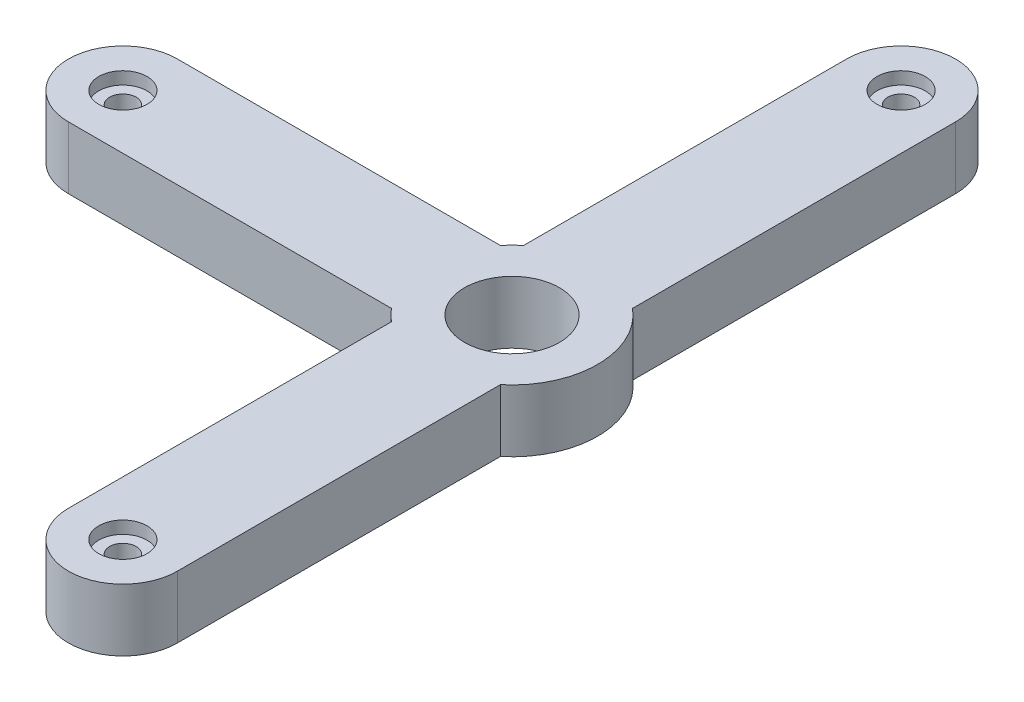
ISO-10303-21;
HEADER;
FILE_DESCRIPTION(('STEP AP214'),'2;1');
FILE_NAME('part.step','',(''),(''),'','','');
FILE_SCHEMA(('AUTOMOTIVE_DESIGN { 1 0 10303 214 1 1 1 1 }'));
ENDSEC;
DATA;
#1=APPLICATION_CONTEXT('core data for automotive mechanical design processes');
#2=APPLICATION_PROTOCOL_DEFINITION('international standard','automotive_design',2000,#1);
#3=PRODUCT_CONTEXT('',#1,'mechanical');
#4=PRODUCT('Part','Part','',(#3));
#5=PRODUCT_RELATED_PRODUCT_CATEGORY('part','',(#4));
#6=PRODUCT_DEFINITION_FORMATION('','',#4);
#7=PRODUCT_DEFINITION_CONTEXT('part definition',#1,'design');
#8=PRODUCT_DEFINITION('design','',#6,#7);
#9=PRODUCT_DEFINITION_SHAPE('','',#8);
#10=(LENGTH_UNIT() NAMED_UNIT(*) SI_UNIT(.MILLI.,.METRE.));
#11=(NAMED_UNIT(*) PLANE_ANGLE_UNIT() SI_UNIT($,.RADIAN.));
#12=(NAMED_UNIT(*) SI_UNIT($,.STERADIAN.) SOLID_ANGLE_UNIT());
#13=UNCERTAINTY_MEASURE_WITH_UNIT(LENGTH_MEASURE(1.E-05),#10,'distance_accuracy_value','');
#14=(GEOMETRIC_REPRESENTATION_CONTEXT(3) GLOBAL_UNCERTAINTY_ASSIGNED_CONTEXT((#13)) GLOBAL_UNIT_ASSIGNED_CONTEXT((#10,
#11,#12)) REPRESENTATION_CONTEXT('',''));
#15=CARTESIAN_POINT('',(0.,0.,0.));
#16=DIRECTION('',(0.,0.,1.));
#17=DIRECTION('',(1.,0.,0.));
#18=AXIS2_PLACEMENT_3D('',#15,#16,#17);
#19=CARTESIAN_POINT('',(-106.291651245989,-150.6,0.));
#20=DIRECTION('',(0.,1.,0.));
#21=DIRECTION('',(0.,0.,1.));
#22=AXIS2_PLACEMENT_3D('',#19,#20,#21);
#23=PLANE('',#22);
#24=CARTESIAN_POINT('',(-106.291651245989,-150.6,0.));
#25=DIRECTION('',(0.,1.,0.));
#26=DIRECTION('',(0.,0.,1.));
#27=AXIS2_PLACEMENT_3D('',#24,#25,#26);
#28=CIRCLE('',#27,1.69999999999999);
#29=CARTESIAN_POINT('',(-106.291651245989,-150.6,1.69999999999999));
#30=VERTEX_POINT('',#29);
#31=EDGE_CURVE('E222',#30,#30,#28,.T.);
#32=ORIENTED_EDGE('',*,*,#31,.F.);
#33=EDGE_LOOP('',(#32));
#34=FACE_BOUND('',#33,.T.);
#35=CARTESIAN_POINT('',(-106.291651245989,-150.6,0.));
#36=DIRECTION('',(0.,1.,0.));
#37=DIRECTION('',(0.,0.,1.));
#38=AXIS2_PLACEMENT_3D('',#35,#36,#37);
#39=CIRCLE('',#38,3.10000000000001);
#40=CARTESIAN_POINT('',(-106.291651245989,-150.6,3.10000000000001));
#41=VERTEX_POINT('',#40);
#42=EDGE_CURVE('E201',#41,#41,#39,.T.);
#43=ORIENTED_EDGE('',*,*,#42,.T.);
#44=EDGE_LOOP('',(#43));
#45=FACE_BOUND('',#44,.T.);
#46=ADVANCED_FACE('F44',(#34,#45),#23,.T.);
#47=CARTESIAN_POINT('',(-56.2916512459885,-150.6,-50.));
#48=DIRECTION('',(0.,1.,0.));
#49=DIRECTION('',(0.,0.,1.));
#50=AXIS2_PLACEMENT_3D('',#47,#48,#49);
#51=CIRCLE('',#50,1.7);
#52=CARTESIAN_POINT('',(-56.2916512459885,-150.6,-48.3));
#53=VERTEX_POINT('',#52);
#54=EDGE_CURVE('E217',#53,#53,#51,.T.);
#55=ORIENTED_EDGE('',*,*,#54,.F.);
#56=EDGE_LOOP('',(#55));
#57=FACE_BOUND('',#56,.T.);
#58=CARTESIAN_POINT('',(-56.2916512459885,-150.6,-50.));
#59=DIRECTION('',(0.,1.,0.));
#60=DIRECTION('',(0.,0.,1.));
#61=AXIS2_PLACEMENT_3D('',#58,#59,#60);
#62=CIRCLE('',#61,3.1);
#63=CARTESIAN_POINT('',(-56.2916512459885,-150.6,-46.9));
#64=VERTEX_POINT('',#63);
#65=EDGE_CURVE('E199',#64,#64,#62,.T.);
#66=ORIENTED_EDGE('',*,*,#65,.T.);
#67=EDGE_LOOP('',(#66));
#68=FACE_BOUND('',#67,.T.);
#69=ADVANCED_FACE('F351',(#57,#68),#23,.T.);
#70=CARTESIAN_POINT('',(-56.2916512459885,-150.6,50.));
#71=DIRECTION('',(0.,1.,0.));
#72=DIRECTION('',(0.,0.,1.));
#73=AXIS2_PLACEMENT_3D('',#70,#71,#72);
#74=CIRCLE('',#73,1.7);
#75=CARTESIAN_POINT('',(-56.2916512459885,-150.6,51.7));
#76=VERTEX_POINT('',#75);
#77=EDGE_CURVE('E214',#76,#76,#74,.T.);
#78=ORIENTED_EDGE('',*,*,#77,.F.);
#79=EDGE_LOOP('',(#78));
#80=FACE_BOUND('',#79,.T.);
#81=CARTESIAN_POINT('',(-56.2916512459885,-150.6,50.));
#82=DIRECTION('',(0.,1.,0.));
#83=DIRECTION('',(0.,0.,1.));
#84=AXIS2_PLACEMENT_3D('',#81,#82,#83);
#85=CIRCLE('',#84,3.1);
#86=CARTESIAN_POINT('',(-56.2916512459885,-150.6,53.1));
#87=VERTEX_POINT('',#86);
#88=EDGE_CURVE('E195',#87,#87,#85,.T.);
#89=ORIENTED_EDGE('',*,*,#88,.T.);
#90=EDGE_LOOP('',(#89));
#91=FACE_BOUND('',#90,.T.);
#92=ADVANCED_FACE('F352',(#80,#91),#23,.T.);
#93=CARTESIAN_POINT('',(-106.291651245989,-157.,0.));
#94=DIRECTION('',(0.,1.,0.));
#95=DIRECTION('',(0.,0.,1.));
#96=AXIS2_PLACEMENT_3D('',#93,#94,#95);
#97=PLANE('',#96);
#98=CARTESIAN_POINT('',(-106.291651245989,-157.,0.));
#99=DIRECTION('',(0.,1.,0.));
#100=DIRECTION('',(0.,0.,1.));
#101=AXIS2_PLACEMENT_3D('',#98,#99,#100);
#102=CIRCLE('',#101,7.);
#103=CARTESIAN_POINT('',(-106.291651245988,-157.,-7.));
#104=VERTEX_POINT('',#103);
#105=CARTESIAN_POINT('',(-106.291651245989,-157.,7.));
#106=VERTEX_POINT('',#105);
#107=EDGE_CURVE('E138',#104,#106,#102,.T.);
#108=ORIENTED_EDGE('',*,*,#107,.F.);
#109=DIRECTION('',(-1.,0.,0.));
#110=VECTOR('',#109,1.);
#111=CARTESIAN_POINT('',(-64.7769326202272,-157.,-6.99999999999992));
#112=LINE('',#111,#110);
#113=CARTESIAN_POINT('',(-64.7769326202272,-157.,-6.99999999999992));
#114=VERTEX_POINT('',#113);
#115=EDGE_CURVE('E58',#114,#104,#112,.T.);
#116=ORIENTED_EDGE('',*,*,#115,.F.);
#117=CARTESIAN_POINT('',(-56.2916512459885,-157.,0.));
#118=DIRECTION('',(0.,1.,0.));
#119=DIRECTION('',(0.,0.,1.));
#120=AXIS2_PLACEMENT_3D('',#117,#118,#119);
#121=CIRCLE('',#120,11.);
#122=CARTESIAN_POINT('',(-63.2916512459885,-157.,-8.48528137423857));
#123=VERTEX_POINT('',#122);
#124=EDGE_CURVE('E69',#123,#114,#121,.T.);
#125=ORIENTED_EDGE('',*,*,#124,.F.);
#126=DIRECTION('',(0.,0.,1.));
#127=VECTOR('',#126,1.);
#128=CARTESIAN_POINT('',(-63.2916512459885,-157.,-50.));
#129=LINE('',#128,#127);
#130=CARTESIAN_POINT('',(-63.2916512459885,-157.,-50.));
#131=VERTEX_POINT('',#130);
#132=EDGE_CURVE('E271',#131,#123,#129,.T.);
#133=ORIENTED_EDGE('',*,*,#132,.F.);
#134=CARTESIAN_POINT('',(-56.2916512459885,-157.,-50.));
#135=DIRECTION('',(0.,1.,0.));
#136=DIRECTION('',(0.,0.,1.));
#137=AXIS2_PLACEMENT_3D('',#134,#135,#136);
#138=CIRCLE('',#137,7.);
#139=CARTESIAN_POINT('',(-49.2916512459885,-157.,-50.));
#140=VERTEX_POINT('',#139);
#141=EDGE_CURVE('E267',#140,#131,#138,.T.);
#142=ORIENTED_EDGE('',*,*,#141,.F.);
#143=DIRECTION('',(0.,0.,-1.));
#144=VECTOR('',#143,1.);
#145=CARTESIAN_POINT('',(-49.2916512459885,-157.,-8.48528137423857));
#146=LINE('',#145,#144);
#147=CARTESIAN_POINT('',(-49.2916512459885,-157.,-8.48528137423857));
#148=VERTEX_POINT('',#147);
#149=EDGE_CURVE('E270',#148,#140,#146,.T.);
#150=ORIENTED_EDGE('',*,*,#149,.F.);
#151=CARTESIAN_POINT('',(-56.2916512459885,-157.,0.));
#152=DIRECTION('',(0.,1.,0.));
#153=DIRECTION('',(0.,0.,1.));
#154=AXIS2_PLACEMENT_3D('',#151,#152,#153);
#155=CIRCLE('',#154,11.);
#156=CARTESIAN_POINT('',(-49.2916512459885,-157.,8.48528137423857));
#157=VERTEX_POINT('',#156);
#158=EDGE_CURVE('E264',#157,#148,#155,.T.);
#159=ORIENTED_EDGE('',*,*,#158,.F.);
#160=DIRECTION('',(0.,0.,-1.));
#161=VECTOR('',#160,1.);
#162=CARTESIAN_POINT('',(-49.2916512459885,-157.,50.));
#163=LINE('',#162,#161);
#164=CARTESIAN_POINT('',(-49.2916512459885,-157.,50.));
#165=VERTEX_POINT('',#164);
#166=EDGE_CURVE('E263',#165,#157,#163,.T.);
#167=ORIENTED_EDGE('',*,*,#166,.F.);
#168=CARTESIAN_POINT('',(-56.2916512459885,-157.,50.));
#169=DIRECTION('',(0.,1.,0.));
#170=DIRECTION('',(0.,0.,1.));
#171=AXIS2_PLACEMENT_3D('',#168,#169,#170);
#172=CIRCLE('',#171,7.);
#173=CARTESIAN_POINT('',(-63.2916512459885,-157.,50.));
#174=VERTEX_POINT('',#173);
#175=EDGE_CURVE('E261',#174,#165,#172,.T.);
#176=ORIENTED_EDGE('',*,*,#175,.F.);
#177=DIRECTION('',(0.,0.,1.));
#178=VECTOR('',#177,1.);
#179=CARTESIAN_POINT('',(-63.2916512459881,-157.,8.48528137423894));
#180=LINE('',#179,#178);
#181=CARTESIAN_POINT('',(-63.2916512459881,-157.,8.48528137423891));
#182=VERTEX_POINT('',#181);
#183=EDGE_CURVE('E259',#182,#174,#180,.T.);
#184=ORIENTED_EDGE('',*,*,#183,.F.);
#185=CARTESIAN_POINT('',(-56.2916512459885,-157.,0.));
#186=DIRECTION('',(0.,1.,0.));
#187=DIRECTION('',(0.,0.,1.));
#188=AXIS2_PLACEMENT_3D('',#185,#186,#187);
#189=CIRCLE('',#188,11.);
#190=CARTESIAN_POINT('',(-64.776932620227,-157.,7.));
#191=VERTEX_POINT('',#190);
#192=EDGE_CURVE('E260',#191,#182,#189,.T.);
#193=ORIENTED_EDGE('',*,*,#192,.F.);
#194=DIRECTION('',(1.,0.,0.));
#195=VECTOR('',#194,1.);
#196=CARTESIAN_POINT('',(-106.291651245989,-157.,7.));
#197=LINE('',#196,#195);
#198=EDGE_CURVE('E254',#106,#191,#197,.T.);
#199=ORIENTED_EDGE('',*,*,#198,.F.);
#200=EDGE_LOOP('',(#108,#116,#125,#133,#142,#150,#159,#167,#176,#184,#193,#199));
#201=FACE_BOUND('',#200,.T.);
#202=CARTESIAN_POINT('',(-106.291651245989,-157.,0.));
#203=DIRECTION('',(0.,1.,0.));
#204=DIRECTION('',(0.,0.,1.));
#205=AXIS2_PLACEMENT_3D('',#202,#203,#204);
#206=CIRCLE('',#205,1.69999999999999);
#207=CARTESIAN_POINT('',(-106.291651245989,-157.,1.69999999999999));
#208=VERTEX_POINT('',#207);
#209=EDGE_CURVE('E253',#208,#208,#206,.T.);
#210=ORIENTED_EDGE('',*,*,#209,.T.);
#211=EDGE_LOOP('',(#210));
#212=FACE_BOUND('',#211,.T.);
#213=CARTESIAN_POINT('',(-56.2916512459885,-157.,-50.));
#214=DIRECTION('',(0.,1.,0.));
#215=DIRECTION('',(0.,0.,1.));
#216=AXIS2_PLACEMENT_3D('',#213,#214,#215);
#217=CIRCLE('',#216,1.7);
#218=CARTESIAN_POINT('',(-56.2916512459885,-157.,-48.3));
#219=VERTEX_POINT('',#218);
#220=EDGE_CURVE('E249',#219,#219,#217,.T.);
#221=ORIENTED_EDGE('',*,*,#220,.T.);
#222=EDGE_LOOP('',(#221));
#223=FACE_BOUND('',#222,.T.);
#224=CARTESIAN_POINT('',(-56.2916512459885,-157.,0.));
#225=DIRECTION('',(0.,1.,0.));
#226=DIRECTION('',(0.,0.,1.));
#227=AXIS2_PLACEMENT_3D('',#224,#225,#226);
#228=CIRCLE('',#227,6.1);
#229=CARTESIAN_POINT('',(-56.2916512459885,-157.,6.1));
#230=VERTEX_POINT('',#229);
#231=EDGE_CURVE('E242',#230,#230,#228,.T.);
#232=ORIENTED_EDGE('',*,*,#231,.T.);
#233=EDGE_LOOP('',(#232));
#234=FACE_BOUND('',#233,.T.);
#235=CARTESIAN_POINT('',(-56.2916512459885,-157.,50.));
#236=DIRECTION('',(0.,1.,0.));
#237=DIRECTION('',(0.,0.,1.));
#238=AXIS2_PLACEMENT_3D('',#235,#236,#237);
#239=CIRCLE('',#238,1.7);
#240=CARTESIAN_POINT('',(-56.2916512459885,-157.,51.7));
#241=VERTEX_POINT('',#240);
#242=EDGE_CURVE('E241',#241,#241,#239,.T.);
#243=ORIENTED_EDGE('',*,*,#242,.T.);
#244=EDGE_LOOP('',(#243));
#245=FACE_BOUND('',#244,.T.);
#246=CARTESIAN_POINT('',(-65.2916512459885,-157.,0.));
#247=DIRECTION('',(0.,1.,0.));
#248=DIRECTION('',(0.,0.,1.));
#249=AXIS2_PLACEMENT_3D('',#246,#247,#248);
#250=CIRCLE('',#249,1.6);
#251=CARTESIAN_POINT('',(-65.2916512459885,-157.,1.6));
#252=VERTEX_POINT('',#251);
#253=EDGE_CURVE('E240',#252,#252,#250,.T.);
#254=ORIENTED_EDGE('',*,*,#253,.T.);
#255=EDGE_LOOP('',(#254));
#256=FACE_BOUND('',#255,.T.);
#257=CARTESIAN_POINT('',(-56.2916512459885,-157.,9.));
#258=DIRECTION('',(0.,1.,0.));
#259=DIRECTION('',(0.,0.,1.));
#260=AXIS2_PLACEMENT_3D('',#257,#258,#259);
#261=CIRCLE('',#260,1.6);
#262=CARTESIAN_POINT('',(-56.2916512459885,-157.,10.6));
#263=VERTEX_POINT('',#262);
#264=EDGE_CURVE('E231',#263,#263,#261,.T.);
#265=ORIENTED_EDGE('',*,*,#264,.T.);
#266=EDGE_LOOP('',(#265));
#267=FACE_BOUND('',#266,.T.);
#268=CARTESIAN_POINT('',(-56.2916512459885,-157.,-9.));
#269=DIRECTION('',(0.,1.,0.));
#270=DIRECTION('',(0.,0.,1.));
#271=AXIS2_PLACEMENT_3D('',#268,#269,#270);
#272=CIRCLE('',#271,1.6);
#273=CARTESIAN_POINT('',(-56.2916512459885,-157.,-7.4));
#274=VERTEX_POINT('',#273);
#275=EDGE_CURVE('E230',#274,#274,#272,.T.);
#276=ORIENTED_EDGE('',*,*,#275,.T.);
#277=EDGE_LOOP('',(#276));
#278=FACE_BOUND('',#277,.T.);
#279=ADVANCED_FACE('F308',(#201,#212,#223,#234,#245,#256,#267,#278),#97,.F.);
#280=CARTESIAN_POINT('',(-106.291651245989,-153.,0.));
#281=DIRECTION('',(0.,-1.,0.));
#282=DIRECTION('',(0.,0.,-1.));
#283=AXIS2_PLACEMENT_3D('',#280,#281,#282);
#284=CYLINDRICAL_SURFACE('',#283,7.);
#285=ORIENTED_EDGE('',*,*,#107,.T.);
#286=DIRECTION('',(0.,-1.,0.));
#287=VECTOR('',#286,1.);
#288=CARTESIAN_POINT('',(-106.291651245989,-153.,7.));
#289=LINE('',#288,#287);
#290=CARTESIAN_POINT('',(-106.291651245989,-149.,7.));
#291=VERTEX_POINT('',#290);
#292=EDGE_CURVE('E11',#291,#106,#289,.T.);
#293=ORIENTED_EDGE('',*,*,#292,.F.);
#294=CARTESIAN_POINT('',(-106.291651245989,-149.,0.));
#295=DIRECTION('',(0.,1.,0.));
#296=DIRECTION('',(0.,0.,1.));
#297=AXIS2_PLACEMENT_3D('',#294,#295,#296);
#298=CIRCLE('',#297,7.);
#299=CARTESIAN_POINT('',(-106.291651245988,-149.,-7.));
#300=VERTEX_POINT('',#299);
#301=EDGE_CURVE('E137',#300,#291,#298,.T.);
#302=ORIENTED_EDGE('',*,*,#301,.F.);
#303=DIRECTION('',(0.,-1.,0.));
#304=VECTOR('',#303,1.);
#305=CARTESIAN_POINT('',(-106.291651245988,-153.,-7.));
#306=LINE('',#305,#304);
#307=EDGE_CURVE('E274',#300,#104,#306,.T.);
#308=ORIENTED_EDGE('',*,*,#307,.T.);
#309=EDGE_LOOP('',(#285,#293,#302,#308));
#310=FACE_BOUND('',#309,.T.);
#311=ADVANCED_FACE('F50',(#310),#284,.T.);
#312=CARTESIAN_POINT('',(-106.291651245989,-153.,7.));
#313=DIRECTION('',(0.,0.,-1.));
#314=DIRECTION('',(-1.,0.,0.));
#315=AXIS2_PLACEMENT_3D('',#312,#313,#314);
#316=PLANE('',#315);
#317=ORIENTED_EDGE('',*,*,#198,.T.);
#318=DIRECTION('',(0.,-1.,0.));
#319=VECTOR('',#318,1.);
#320=CARTESIAN_POINT('',(-64.776932620227,-153.,7.));
#321=LINE('',#320,#319);
#322=CARTESIAN_POINT('',(-64.776932620227,-149.,7.));
#323=VERTEX_POINT('',#322);
#324=EDGE_CURVE('E52',#323,#191,#321,.T.);
#325=ORIENTED_EDGE('',*,*,#324,.F.);
#326=DIRECTION('',(1.,0.,0.));
#327=VECTOR('',#326,1.);
#328=CARTESIAN_POINT('',(-106.291651245989,-149.,7.));
#329=LINE('',#328,#327);
#330=EDGE_CURVE('E142',#291,#323,#329,.T.);
#331=ORIENTED_EDGE('',*,*,#330,.F.);
#332=ORIENTED_EDGE('',*,*,#292,.T.);
#333=EDGE_LOOP('',(#317,#325,#331,#332));
#334=FACE_BOUND('',#333,.T.);
#335=ADVANCED_FACE('F141',(#334),#316,.F.);
#336=CARTESIAN_POINT('',(-56.2916512459885,-153.,0.));
#337=DIRECTION('',(0.,-1.,0.));
#338=DIRECTION('',(0.,0.,-1.));
#339=AXIS2_PLACEMENT_3D('',#336,#337,#338);
#340=CYLINDRICAL_SURFACE('',#339,11.);
#341=ORIENTED_EDGE('',*,*,#192,.T.);
#342=DIRECTION('',(0.,-1.,0.));
#343=VECTOR('',#342,1.);
#344=CARTESIAN_POINT('',(-63.2916512459881,-153.,8.48528137423891));
#345=LINE('',#344,#343);
#346=CARTESIAN_POINT('',(-63.2916512459881,-149.,8.48528137423891));
#347=VERTEX_POINT('',#346);
#348=EDGE_CURVE('E298',#347,#182,#345,.T.);
#349=ORIENTED_EDGE('',*,*,#348,.F.);
#350=CARTESIAN_POINT('',(-56.2916512459885,-149.,0.));
#351=DIRECTION('',(0.,1.,0.));
#352=DIRECTION('',(0.,0.,1.));
#353=AXIS2_PLACEMENT_3D('',#350,#351,#352);
#354=CIRCLE('',#353,11.);
#355=EDGE_CURVE('E146',#323,#347,#354,.T.);
#356=ORIENTED_EDGE('',*,*,#355,.F.);
#357=ORIENTED_EDGE('',*,*,#324,.T.);
#358=EDGE_LOOP('',(#341,#349,#356,#357));
#359=FACE_BOUND('',#358,.T.);
#360=ADVANCED_FACE('F304',(#359),#340,.T.);
#361=CARTESIAN_POINT('',(-63.2916512459881,-153.,8.48528137423894));
#362=DIRECTION('',(1.,0.,0.));
#363=DIRECTION('',(0.,0.,-1.));
#364=AXIS2_PLACEMENT_3D('',#361,#362,#363);
#365=PLANE('',#364);
#366=ORIENTED_EDGE('',*,*,#183,.T.);
#367=DIRECTION('',(0.,-1.,0.));
#368=VECTOR('',#367,1.);
#369=CARTESIAN_POINT('',(-63.2916512459885,-153.,50.));
#370=LINE('',#369,#368);
#371=CARTESIAN_POINT('',(-63.2916512459885,-149.,50.));
#372=VERTEX_POINT('',#371);
#373=EDGE_CURVE('E299',#372,#174,#370,.T.);
#374=ORIENTED_EDGE('',*,*,#373,.F.);
#375=DIRECTION('',(0.,0.,1.));
#376=VECTOR('',#375,1.);
#377=CARTESIAN_POINT('',(-63.2916512459881,-149.,8.48528137423894));
#378=LINE('',#377,#376);
#379=EDGE_CURVE('E163',#347,#372,#378,.T.);
#380=ORIENTED_EDGE('',*,*,#379,.F.);
#381=ORIENTED_EDGE('',*,*,#348,.T.);
#382=EDGE_LOOP('',(#366,#374,#380,#381));
#383=FACE_BOUND('',#382,.T.);
#384=ADVANCED_FACE('F313',(#383),#365,.F.);
#385=CARTESIAN_POINT('',(-56.2916512459885,-153.,50.));
#386=DIRECTION('',(0.,-1.,0.));
#387=DIRECTION('',(0.,0.,-1.));
#388=AXIS2_PLACEMENT_3D('',#385,#386,#387);
#389=CYLINDRICAL_SURFACE('',#388,7.);
#390=ORIENTED_EDGE('',*,*,#175,.T.);
#391=DIRECTION('',(0.,-1.,0.));
#392=VECTOR('',#391,1.);
#393=CARTESIAN_POINT('',(-49.2916512459885,-153.,50.));
#394=LINE('',#393,#392);
#395=CARTESIAN_POINT('',(-49.2916512459885,-149.,50.));
#396=VERTEX_POINT('',#395);
#397=EDGE_CURVE('E291',#396,#165,#394,.T.);
#398=ORIENTED_EDGE('',*,*,#397,.F.);
#399=CARTESIAN_POINT('',(-56.2916512459885,-149.,50.));
#400=DIRECTION('',(0.,1.,0.));
#401=DIRECTION('',(0.,0.,1.));
#402=AXIS2_PLACEMENT_3D('',#399,#400,#401);
#403=CIRCLE('',#402,7.);
#404=EDGE_CURVE('E170',#372,#396,#403,.T.);
#405=ORIENTED_EDGE('',*,*,#404,.F.);
#406=ORIENTED_EDGE('',*,*,#373,.T.);
#407=EDGE_LOOP('',(#390,#398,#405,#406));
#408=FACE_BOUND('',#407,.T.);
#409=ADVANCED_FACE('F312',(#408),#389,.T.);
#410=CARTESIAN_POINT('',(-49.2916512459885,-153.,50.));
#411=DIRECTION('',(-1.,0.,0.));
#412=DIRECTION('',(0.,0.,1.));
#413=AXIS2_PLACEMENT_3D('',#410,#411,#412);
#414=PLANE('',#413);
#415=ORIENTED_EDGE('',*,*,#166,.T.);
#416=DIRECTION('',(0.,-1.,0.));
#417=VECTOR('',#416,1.);
#418=CARTESIAN_POINT('',(-49.2916512459885,-153.,8.48528137423857));
#419=LINE('',#418,#417);
#420=CARTESIAN_POINT('',(-49.2916512459885,-149.,8.48528137423857));
#421=VERTEX_POINT('',#420);
#422=EDGE_CURVE('E290',#421,#157,#419,.T.);
#423=ORIENTED_EDGE('',*,*,#422,.F.);
#424=DIRECTION('',(0.,0.,-1.));
#425=VECTOR('',#424,1.);
#426=CARTESIAN_POINT('',(-49.2916512459885,-149.,50.));
#427=LINE('',#426,#425);
#428=EDGE_CURVE('E168',#396,#421,#427,.T.);
#429=ORIENTED_EDGE('',*,*,#428,.F.);
#430=ORIENTED_EDGE('',*,*,#397,.T.);
#431=EDGE_LOOP('',(#415,#423,#429,#430));
#432=FACE_BOUND('',#431,.T.);
#433=ADVANCED_FACE('F317',(#432),#414,.F.);
#434=CARTESIAN_POINT('',(-56.2916512459885,-153.,0.));
#435=DIRECTION('',(0.,-1.,0.));
#436=DIRECTION('',(0.,0.,-1.));
#437=AXIS2_PLACEMENT_3D('',#434,#435,#436);
#438=CYLINDRICAL_SURFACE('',#437,11.);
#439=ORIENTED_EDGE('',*,*,#158,.T.);
#440=DIRECTION('',(0.,-1.,0.));
#441=VECTOR('',#440,1.);
#442=CARTESIAN_POINT('',(-49.2916512459885,-153.,-8.48528137423857));
#443=LINE('',#442,#441);
#444=CARTESIAN_POINT('',(-49.2916512459885,-149.,-8.48528137423857));
#445=VERTEX_POINT('',#444);
#446=EDGE_CURVE('E287',#445,#148,#443,.T.);
#447=ORIENTED_EDGE('',*,*,#446,.F.);
#448=CARTESIAN_POINT('',(-56.2916512459885,-149.,0.));
#449=DIRECTION('',(0.,1.,0.));
#450=DIRECTION('',(0.,0.,1.));
#451=AXIS2_PLACEMENT_3D('',#448,#449,#450);
#452=CIRCLE('',#451,11.);
#453=EDGE_CURVE('E175',#421,#445,#452,.T.);
#454=ORIENTED_EDGE('',*,*,#453,.F.);
#455=ORIENTED_EDGE('',*,*,#422,.T.);
#456=EDGE_LOOP('',(#439,#447,#454,#455));
#457=FACE_BOUND('',#456,.T.);
#458=ADVANCED_FACE('F325',(#457),#438,.T.);
#459=CARTESIAN_POINT('',(-49.2916512459885,-153.,-8.48528137423857));
#460=DIRECTION('',(-1.,0.,0.));
#461=DIRECTION('',(0.,0.,1.));
#462=AXIS2_PLACEMENT_3D('',#459,#460,#461);
#463=PLANE('',#462);
#464=ORIENTED_EDGE('',*,*,#149,.T.);
#465=DIRECTION('',(0.,-1.,0.));
#466=VECTOR('',#465,1.);
#467=CARTESIAN_POINT('',(-49.2916512459885,-153.,-50.));
#468=LINE('',#467,#466);
#469=CARTESIAN_POINT('',(-49.2916512459885,-149.,-50.));
#470=VERTEX_POINT('',#469);
#471=EDGE_CURVE('E283',#470,#140,#468,.T.);
#472=ORIENTED_EDGE('',*,*,#471,.F.);
#473=DIRECTION('',(0.,0.,-1.));
#474=VECTOR('',#473,1.);
#475=CARTESIAN_POINT('',(-49.2916512459885,-149.,-8.48528137423857));
#476=LINE('',#475,#474);
#477=EDGE_CURVE('E176',#445,#470,#476,.T.);
#478=ORIENTED_EDGE('',*,*,#477,.F.);
#479=ORIENTED_EDGE('',*,*,#446,.T.);
#480=EDGE_LOOP('',(#464,#472,#478,#479));
#481=FACE_BOUND('',#480,.T.);
#482=ADVANCED_FACE('F330',(#481),#463,.F.);
#483=CARTESIAN_POINT('',(-56.2916512459885,-153.,-50.));
#484=DIRECTION('',(0.,-1.,0.));
#485=DIRECTION('',(0.,0.,-1.));
#486=AXIS2_PLACEMENT_3D('',#483,#484,#485);
#487=CYLINDRICAL_SURFACE('',#486,7.);
#488=ORIENTED_EDGE('',*,*,#141,.T.);
#489=DIRECTION('',(0.,-1.,0.));
#490=VECTOR('',#489,1.);
#491=CARTESIAN_POINT('',(-63.2916512459885,-153.,-50.));
#492=LINE('',#491,#490);
#493=CARTESIAN_POINT('',(-63.2916512459885,-149.,-50.));
#494=VERTEX_POINT('',#493);
#495=EDGE_CURVE('E284',#494,#131,#492,.T.);
#496=ORIENTED_EDGE('',*,*,#495,.F.);
#497=CARTESIAN_POINT('',(-56.2916512459885,-149.,-50.));
#498=DIRECTION('',(0.,1.,0.));
#499=DIRECTION('',(0.,0.,1.));
#500=AXIS2_PLACEMENT_3D('',#497,#498,#499);
#501=CIRCLE('',#500,7.);
#502=EDGE_CURVE('E178',#470,#494,#501,.T.);
#503=ORIENTED_EDGE('',*,*,#502,.F.);
#504=ORIENTED_EDGE('',*,*,#471,.T.);
#505=EDGE_LOOP('',(#488,#496,#503,#504));
#506=FACE_BOUND('',#505,.T.);
#507=ADVANCED_FACE('F332',(#506),#487,.T.);
#508=CARTESIAN_POINT('',(-63.2916512459885,-153.,-50.));
#509=DIRECTION('',(1.,0.,0.));
#510=DIRECTION('',(0.,0.,-1.));
#511=AXIS2_PLACEMENT_3D('',#508,#509,#510);
#512=PLANE('',#511);
#513=ORIENTED_EDGE('',*,*,#132,.T.);
#514=DIRECTION('',(0.,-1.,0.));
#515=VECTOR('',#514,1.);
#516=CARTESIAN_POINT('',(-63.2916512459885,-153.,-8.48528137423857));
#517=LINE('',#516,#515);
#518=CARTESIAN_POINT('',(-63.2916512459885,-149.,-8.48528137423857));
#519=VERTEX_POINT('',#518);
#520=EDGE_CURVE('E276',#519,#123,#517,.T.);
#521=ORIENTED_EDGE('',*,*,#520,.F.);
#522=DIRECTION('',(0.,0.,1.));
#523=VECTOR('',#522,1.);
#524=CARTESIAN_POINT('',(-63.2916512459885,-149.,-50.));
#525=LINE('',#524,#523);
#526=EDGE_CURVE('E185',#494,#519,#525,.T.);
#527=ORIENTED_EDGE('',*,*,#526,.F.);
#528=ORIENTED_EDGE('',*,*,#495,.T.);
#529=EDGE_LOOP('',(#513,#521,#527,#528));
#530=FACE_BOUND('',#529,.T.);
#531=ADVANCED_FACE('F333',(#530),#512,.F.);
#532=CARTESIAN_POINT('',(-56.2916512459885,-153.,0.));
#533=DIRECTION('',(0.,-1.,0.));
#534=DIRECTION('',(0.,0.,-1.));
#535=AXIS2_PLACEMENT_3D('',#532,#533,#534);
#536=CYLINDRICAL_SURFACE('',#535,11.);
#537=ORIENTED_EDGE('',*,*,#124,.T.);
#538=DIRECTION('',(0.,-1.,0.));
#539=VECTOR('',#538,1.);
#540=CARTESIAN_POINT('',(-64.7769326202272,-153.,-6.99999999999992));
#541=LINE('',#540,#539);
#542=CARTESIAN_POINT('',(-64.7769326202272,-149.,-6.99999999999992));
#543=VERTEX_POINT('',#542);
#544=EDGE_CURVE('E280',#543,#114,#541,.T.);
#545=ORIENTED_EDGE('',*,*,#544,.F.);
#546=CARTESIAN_POINT('',(-56.2916512459885,-149.,0.));
#547=DIRECTION('',(0.,1.,0.));
#548=DIRECTION('',(0.,0.,1.));
#549=AXIS2_PLACEMENT_3D('',#546,#547,#548);
#550=CIRCLE('',#549,11.);
#551=EDGE_CURVE('E183',#519,#543,#550,.T.);
#552=ORIENTED_EDGE('',*,*,#551,.F.);
#553=ORIENTED_EDGE('',*,*,#520,.T.);
#554=EDGE_LOOP('',(#537,#545,#552,#553));
#555=FACE_BOUND('',#554,.T.);
#556=ADVANCED_FACE('F339',(#555),#536,.T.);
#557=CARTESIAN_POINT('',(-64.7769326202272,-153.,-6.99999999999992));
#558=DIRECTION('',(0.,0.,1.));
#559=DIRECTION('',(1.,0.,0.));
#560=AXIS2_PLACEMENT_3D('',#557,#558,#559);
#561=PLANE('',#560);
#562=ORIENTED_EDGE('',*,*,#115,.T.);
#563=ORIENTED_EDGE('',*,*,#307,.F.);
#564=DIRECTION('',(-1.,0.,0.));
#565=VECTOR('',#564,1.);
#566=CARTESIAN_POINT('',(-64.7769326202272,-149.,-6.99999999999992));
#567=LINE('',#566,#565);
#568=EDGE_CURVE('E154',#543,#300,#567,.T.);
#569=ORIENTED_EDGE('',*,*,#568,.F.);
#570=ORIENTED_EDGE('',*,*,#544,.T.);
#571=EDGE_LOOP('',(#562,#563,#569,#570));
#572=FACE_BOUND('',#571,.T.);
#573=ADVANCED_FACE('F336',(#572),#561,.F.);
#574=CARTESIAN_POINT('',(-106.291651245989,-153.,0.));
#575=DIRECTION('',(0.,-1.,0.));
#576=DIRECTION('',(0.,0.,-1.));
#577=AXIS2_PLACEMENT_3D('',#574,#575,#576);
#578=CYLINDRICAL_SURFACE('',#577,1.69999999999999);
#579=ORIENTED_EDGE('',*,*,#209,.F.);
#580=EDGE_LOOP('',(#579));
#581=FACE_BOUND('',#580,.T.);
#582=ORIENTED_EDGE('',*,*,#31,.T.);
#583=EDGE_LOOP('',(#582));
#584=FACE_BOUND('',#583,.T.);
#585=ADVANCED_FACE('F338',(#581,#584),#578,.F.);
#586=CARTESIAN_POINT('',(-56.2916512459885,-153.,-50.));
#587=DIRECTION('',(0.,-1.,0.));
#588=DIRECTION('',(0.,0.,-1.));
#589=AXIS2_PLACEMENT_3D('',#586,#587,#588);
#590=CYLINDRICAL_SURFACE('',#589,1.7);
#591=ORIENTED_EDGE('',*,*,#220,.F.);
#592=EDGE_LOOP('',(#591));
#593=FACE_BOUND('',#592,.T.);
#594=ORIENTED_EDGE('',*,*,#54,.T.);
#595=EDGE_LOOP('',(#594));
#596=FACE_BOUND('',#595,.T.);
#597=ADVANCED_FACE('F347',(#593,#596),#590,.F.);
#598=CARTESIAN_POINT('',(-56.2916512459885,-153.,0.));
#599=DIRECTION('',(0.,-1.,0.));
#600=DIRECTION('',(0.,0.,-1.));
#601=AXIS2_PLACEMENT_3D('',#598,#599,#600);
#602=CYLINDRICAL_SURFACE('',#601,6.1);
#603=ORIENTED_EDGE('',*,*,#231,.F.);
#604=EDGE_LOOP('',(#603));
#605=FACE_BOUND('',#604,.T.);
#606=CARTESIAN_POINT('',(-56.2916512459885,-149.,0.));
#607=DIRECTION('',(0.,1.,0.));
#608=DIRECTION('',(0.,0.,1.));
#609=AXIS2_PLACEMENT_3D('',#606,#607,#608);
#610=CIRCLE('',#609,6.1);
#611=CARTESIAN_POINT('',(-56.2916512459885,-149.,6.1));
#612=VERTEX_POINT('',#611);
#613=EDGE_CURVE('E156',#612,#612,#610,.T.);
#614=ORIENTED_EDGE('',*,*,#613,.T.);
#615=EDGE_LOOP('',(#614));
#616=FACE_BOUND('',#615,.T.);
#617=ADVANCED_FACE('F459',(#605,#616),#602,.F.);
#618=CARTESIAN_POINT('',(-56.2916512459885,-153.,50.));
#619=DIRECTION('',(0.,-1.,0.));
#620=DIRECTION('',(0.,0.,-1.));
#621=AXIS2_PLACEMENT_3D('',#618,#619,#620);
#622=CYLINDRICAL_SURFACE('',#621,1.7);
#623=ORIENTED_EDGE('',*,*,#242,.F.);
#624=EDGE_LOOP('',(#623));
#625=FACE_BOUND('',#624,.T.);
#626=ORIENTED_EDGE('',*,*,#77,.T.);
#627=EDGE_LOOP('',(#626));
#628=FACE_BOUND('',#627,.T.);
#629=ADVANCED_FACE('F464',(#625,#628),#622,.F.);
#630=CARTESIAN_POINT('',(-65.2916512459885,-153.,0.));
#631=DIRECTION('',(0.,-1.,0.));
#632=DIRECTION('',(0.,0.,-1.));
#633=AXIS2_PLACEMENT_3D('',#630,#631,#632);
#634=CYLINDRICAL_SURFACE('',#633,1.6);
#635=CARTESIAN_POINT('',(-65.2916512459885,-153.,0.));
#636=DIRECTION('',(0.,1.,0.));
#637=DIRECTION('',(0.,0.,1.));
#638=AXIS2_PLACEMENT_3D('',#635,#636,#637);
#639=CIRCLE('',#638,1.6);
#640=CARTESIAN_POINT('',(-65.2916512459885,-153.,1.6));
#641=VERTEX_POINT('',#640);
#642=EDGE_CURVE('E226',#641,#641,#639,.T.);
#643=ORIENTED_EDGE('',*,*,#642,.T.);
#644=EDGE_LOOP('',(#643));
#645=FACE_BOUND('',#644,.T.);
#646=ORIENTED_EDGE('',*,*,#253,.F.);
#647=EDGE_LOOP('',(#646));
#648=FACE_BOUND('',#647,.T.);
#649=ADVANCED_FACE('F648',(#645,#648),#634,.F.);
#650=CARTESIAN_POINT('',(-56.2916512459885,-153.,9.));
#651=DIRECTION('',(0.,-1.,0.));
#652=DIRECTION('',(0.,0.,-1.));
#653=AXIS2_PLACEMENT_3D('',#650,#651,#652);
#654=CYLINDRICAL_SURFACE('',#653,1.6);
#655=CARTESIAN_POINT('',(-56.2916512459885,-153.,9.));
#656=DIRECTION('',(0.,1.,0.));
#657=DIRECTION('',(0.,0.,1.));
#658=AXIS2_PLACEMENT_3D('',#655,#656,#657);
#659=CIRCLE('',#658,1.6);
#660=CARTESIAN_POINT('',(-56.2916512459885,-153.,10.6));
#661=VERTEX_POINT('',#660);
#662=EDGE_CURVE('E232',#661,#661,#659,.T.);
#663=ORIENTED_EDGE('',*,*,#662,.T.);
#664=EDGE_LOOP('',(#663));
#665=FACE_BOUND('',#664,.T.);
#666=ORIENTED_EDGE('',*,*,#264,.F.);
#667=EDGE_LOOP('',(#666));
#668=FACE_BOUND('',#667,.T.);
#669=ADVANCED_FACE('F757',(#665,#668),#654,.F.);
#670=CARTESIAN_POINT('',(-56.2916512459885,-153.,-9.));
#671=DIRECTION('',(0.,-1.,0.));
#672=DIRECTION('',(0.,0.,-1.));
#673=AXIS2_PLACEMENT_3D('',#670,#671,#672);
#674=CYLINDRICAL_SURFACE('',#673,1.6);
#675=CARTESIAN_POINT('',(-56.2916512459885,-153.,-9.));
#676=DIRECTION('',(0.,1.,0.));
#677=DIRECTION('',(0.,0.,1.));
#678=AXIS2_PLACEMENT_3D('',#675,#676,#677);
#679=CIRCLE('',#678,1.6);
#680=CARTESIAN_POINT('',(-56.2916512459885,-153.,-7.4));
#681=VERTEX_POINT('',#680);
#682=EDGE_CURVE('E221',#681,#681,#679,.T.);
#683=ORIENTED_EDGE('',*,*,#682,.T.);
#684=EDGE_LOOP('',(#683));
#685=FACE_BOUND('',#684,.T.);
#686=ORIENTED_EDGE('',*,*,#275,.F.);
#687=EDGE_LOOP('',(#686));
#688=FACE_BOUND('',#687,.T.);
#689=ADVANCED_FACE('F640',(#685,#688),#674,.F.);
#690=CARTESIAN_POINT('',(-106.291651245989,-153.,0.));
#691=DIRECTION('',(0.,1.,0.));
#692=DIRECTION('',(0.,0.,1.));
#693=AXIS2_PLACEMENT_3D('',#690,#691,#692);
#694=PLANE('',#693);
#695=CARTESIAN_POINT('',(-56.2916512459885,-153.,9.));
#696=DIRECTION('',(0.,1.,0.));
#697=DIRECTION('',(0.,0.,1.));
#698=AXIS2_PLACEMENT_3D('',#695,#696,#697);
#699=CIRCLE('',#698,1.1);
#700=CARTESIAN_POINT('',(-56.2916512459885,-153.,10.1));
#701=VERTEX_POINT('',#700);
#702=EDGE_CURVE('E207',#701,#701,#699,.T.);
#703=ORIENTED_EDGE('',*,*,#702,.T.);
#704=EDGE_LOOP('',(#703));
#705=FACE_BOUND('',#704,.T.);
#706=ORIENTED_EDGE('',*,*,#662,.F.);
#707=EDGE_LOOP('',(#706));
#708=FACE_BOUND('',#707,.T.);
#709=ADVANCED_FACE('F426',(#705,#708),#694,.F.);
#710=CARTESIAN_POINT('',(-65.2916512459885,-153.,0.));
#711=DIRECTION('',(0.,1.,0.));
#712=DIRECTION('',(0.,0.,1.));
#713=AXIS2_PLACEMENT_3D('',#710,#711,#712);
#714=CIRCLE('',#713,1.1);
#715=CARTESIAN_POINT('',(-65.2916512459885,-153.,1.1));
#716=VERTEX_POINT('',#715);
#717=EDGE_CURVE('E215',#716,#716,#714,.T.);
#718=ORIENTED_EDGE('',*,*,#717,.T.);
#719=EDGE_LOOP('',(#718));
#720=FACE_BOUND('',#719,.T.);
#721=ORIENTED_EDGE('',*,*,#642,.F.);
#722=EDGE_LOOP('',(#721));
#723=FACE_BOUND('',#722,.T.);
#724=ADVANCED_FACE('F424',(#720,#723),#694,.F.);
#725=CARTESIAN_POINT('',(-56.2916512459885,-153.,-9.));
#726=DIRECTION('',(0.,1.,0.));
#727=DIRECTION('',(0.,0.,1.));
#728=AXIS2_PLACEMENT_3D('',#725,#726,#727);
#729=CIRCLE('',#728,1.1);
#730=CARTESIAN_POINT('',(-56.2916512459885,-153.,-7.9));
#731=VERTEX_POINT('',#730);
#732=EDGE_CURVE('E206',#731,#731,#729,.T.);
#733=ORIENTED_EDGE('',*,*,#732,.T.);
#734=EDGE_LOOP('',(#733));
#735=FACE_BOUND('',#734,.T.);
#736=ORIENTED_EDGE('',*,*,#682,.F.);
#737=EDGE_LOOP('',(#736));
#738=FACE_BOUND('',#737,.T.);
#739=ADVANCED_FACE('F419',(#735,#738),#694,.F.);
#740=CARTESIAN_POINT('',(-65.2916512459885,-150.6,0.));
#741=DIRECTION('',(0.,-1.,0.));
#742=DIRECTION('',(0.,0.,-1.));
#743=AXIS2_PLACEMENT_3D('',#740,#741,#742);
#744=CYLINDRICAL_SURFACE('',#743,1.1);
#745=ORIENTED_EDGE('',*,*,#717,.F.);
#746=EDGE_LOOP('',(#745));
#747=FACE_BOUND('',#746,.T.);
#748=CARTESIAN_POINT('',(-65.2916512459885,-150.,0.));
#749=DIRECTION('',(0.,1.,0.));
#750=DIRECTION('',(0.,0.,1.));
#751=AXIS2_PLACEMENT_3D('',#748,#749,#750);
#752=CIRCLE('',#751,1.1);
#753=CARTESIAN_POINT('',(-65.2916512459885,-150.,1.1));
#754=VERTEX_POINT('',#753);
#755=EDGE_CURVE('E191',#754,#754,#752,.T.);
#756=ORIENTED_EDGE('',*,*,#755,.T.);
#757=EDGE_LOOP('',(#756));
#758=FACE_BOUND('',#757,.T.);
#759=ADVANCED_FACE('F416',(#747,#758),#744,.F.);
#760=CARTESIAN_POINT('',(-56.2916512459885,-150.6,9.));
#761=DIRECTION('',(0.,-1.,0.));
#762=DIRECTION('',(0.,0.,-1.));
#763=AXIS2_PLACEMENT_3D('',#760,#761,#762);
#764=CYLINDRICAL_SURFACE('',#763,1.1);
#765=ORIENTED_EDGE('',*,*,#702,.F.);
#766=EDGE_LOOP('',(#765));
#767=FACE_BOUND('',#766,.T.);
#768=CARTESIAN_POINT('',(-56.2916512459885,-150.,9.));
#769=DIRECTION('',(0.,1.,0.));
#770=DIRECTION('',(0.,0.,1.));
#771=AXIS2_PLACEMENT_3D('',#768,#769,#770);
#772=CIRCLE('',#771,1.1);
#773=CARTESIAN_POINT('',(-56.2916512459885,-150.,10.1));
#774=VERTEX_POINT('',#773);
#775=EDGE_CURVE('E192',#774,#774,#772,.T.);
#776=ORIENTED_EDGE('',*,*,#775,.T.);
#777=EDGE_LOOP('',(#776));
#778=FACE_BOUND('',#777,.T.);
#779=ADVANCED_FACE('F415',(#767,#778),#764,.F.);
#780=CARTESIAN_POINT('',(-56.2916512459885,-150.6,-9.));
#781=DIRECTION('',(0.,-1.,0.));
#782=DIRECTION('',(0.,0.,-1.));
#783=AXIS2_PLACEMENT_3D('',#780,#781,#782);
#784=CYLINDRICAL_SURFACE('',#783,1.1);
#785=ORIENTED_EDGE('',*,*,#732,.F.);
#786=EDGE_LOOP('',(#785));
#787=FACE_BOUND('',#786,.T.);
#788=CARTESIAN_POINT('',(-56.2916512459885,-150.,-9.));
#789=DIRECTION('',(0.,1.,0.));
#790=DIRECTION('',(0.,0.,1.));
#791=AXIS2_PLACEMENT_3D('',#788,#789,#790);
#792=CIRCLE('',#791,1.1);
#793=CARTESIAN_POINT('',(-56.2916512459885,-150.,-7.9));
#794=VERTEX_POINT('',#793);
#795=EDGE_CURVE('E190',#794,#794,#792,.T.);
#796=ORIENTED_EDGE('',*,*,#795,.T.);
#797=EDGE_LOOP('',(#796));
#798=FACE_BOUND('',#797,.T.);
#799=ADVANCED_FACE('F411',(#787,#798),#784,.F.);
#800=CARTESIAN_POINT('',(-106.291651245989,-150.,0.));
#801=DIRECTION('',(0.,-1.,0.));
#802=DIRECTION('',(0.,0.,-1.));
#803=AXIS2_PLACEMENT_3D('',#800,#801,#802);
#804=CYLINDRICAL_SURFACE('',#803,3.10000000000001);
#805=ORIENTED_EDGE('',*,*,#42,.F.);
#806=EDGE_LOOP('',(#805));
#807=FACE_BOUND('',#806,.T.);
#808=CARTESIAN_POINT('',(-106.291651245989,-149.,0.));
#809=DIRECTION('',(0.,1.,0.));
#810=DIRECTION('',(0.,0.,1.));
#811=AXIS2_PLACEMENT_3D('',#808,#809,#810);
#812=CIRCLE('',#811,3.10000000000001);
#813=CARTESIAN_POINT('',(-106.291651245989,-149.,3.10000000000001));
#814=VERTEX_POINT('',#813);
#815=EDGE_CURVE('E157',#814,#814,#812,.T.);
#816=ORIENTED_EDGE('',*,*,#815,.T.);
#817=EDGE_LOOP('',(#816));
#818=FACE_BOUND('',#817,.T.);
#819=ADVANCED_FACE('F391',(#807,#818),#804,.F.);
#820=CARTESIAN_POINT('',(-56.2916512459885,-150.,-50.));
#821=DIRECTION('',(0.,-1.,0.));
#822=DIRECTION('',(0.,0.,-1.));
#823=AXIS2_PLACEMENT_3D('',#820,#821,#822);
#824=CYLINDRICAL_SURFACE('',#823,3.1);
#825=ORIENTED_EDGE('',*,*,#65,.F.);
#826=EDGE_LOOP('',(#825));
#827=FACE_BOUND('',#826,.T.);
#828=CARTESIAN_POINT('',(-56.2916512459885,-149.,-50.));
#829=DIRECTION('',(0.,1.,0.));
#830=DIRECTION('',(0.,0.,1.));
#831=AXIS2_PLACEMENT_3D('',#828,#829,#830);
#832=CIRCLE('',#831,3.1);
#833=CARTESIAN_POINT('',(-56.2916512459885,-149.,-46.9));
#834=VERTEX_POINT('',#833);
#835=EDGE_CURVE('E384',#834,#834,#832,.T.);
#836=ORIENTED_EDGE('',*,*,#835,.T.);
#837=EDGE_LOOP('',(#836));
#838=FACE_BOUND('',#837,.T.);
#839=ADVANCED_FACE('F377',(#827,#838),#824,.F.);
#840=CARTESIAN_POINT('',(-56.2916512459885,-150.,50.));
#841=DIRECTION('',(0.,-1.,0.));
#842=DIRECTION('',(0.,0.,-1.));
#843=AXIS2_PLACEMENT_3D('',#840,#841,#842);
#844=CYLINDRICAL_SURFACE('',#843,3.1);
#845=ORIENTED_EDGE('',*,*,#88,.F.);
#846=EDGE_LOOP('',(#845));
#847=FACE_BOUND('',#846,.T.);
#848=CARTESIAN_POINT('',(-56.2916512459885,-149.,50.));
#849=DIRECTION('',(0.,1.,0.));
#850=DIRECTION('',(0.,0.,1.));
#851=AXIS2_PLACEMENT_3D('',#848,#849,#850);
#852=CIRCLE('',#851,3.1);
#853=CARTESIAN_POINT('',(-56.2916512459885,-149.,53.1));
#854=VERTEX_POINT('',#853);
#855=EDGE_CURVE('E382',#854,#854,#852,.T.);
#856=ORIENTED_EDGE('',*,*,#855,.T.);
#857=EDGE_LOOP('',(#856));
#858=FACE_BOUND('',#857,.T.);
#859=ADVANCED_FACE('F374',(#847,#858),#844,.F.);
#860=CARTESIAN_POINT('',(-106.291651245989,-150.,0.));
#861=DIRECTION('',(0.,1.,0.));
#862=DIRECTION('',(0.,0.,1.));
#863=AXIS2_PLACEMENT_3D('',#860,#861,#862);
#864=PLANE('',#863);
#865=ORIENTED_EDGE('',*,*,#795,.F.);
#866=EDGE_LOOP('',(#865));
#867=FACE_BOUND('',#866,.T.);
#868=ADVANCED_FACE('F378',(#867),#864,.F.);
#869=ORIENTED_EDGE('',*,*,#755,.F.);
#870=EDGE_LOOP('',(#869));
#871=FACE_BOUND('',#870,.T.);
#872=ADVANCED_FACE('F400',(#871),#864,.F.);
#873=ORIENTED_EDGE('',*,*,#775,.F.);
#874=EDGE_LOOP('',(#873));
#875=FACE_BOUND('',#874,.T.);
#876=ADVANCED_FACE('F393',(#875),#864,.F.);
#877=CARTESIAN_POINT('',(-106.291651245989,-149.,0.));
#878=DIRECTION('',(0.,1.,0.));
#879=DIRECTION('',(0.,0.,1.));
#880=AXIS2_PLACEMENT_3D('',#877,#878,#879);
#881=PLANE('',#880);
#882=ORIENTED_EDGE('',*,*,#835,.F.);
#883=EDGE_LOOP('',(#882));
#884=FACE_BOUND('',#883,.T.);
#885=ORIENTED_EDGE('',*,*,#613,.F.);
#886=EDGE_LOOP('',(#885));
#887=FACE_BOUND('',#886,.T.);
#888=ORIENTED_EDGE('',*,*,#301,.T.);
#889=ORIENTED_EDGE('',*,*,#330,.T.);
#890=ORIENTED_EDGE('',*,*,#355,.T.);
#891=ORIENTED_EDGE('',*,*,#379,.T.);
#892=ORIENTED_EDGE('',*,*,#404,.T.);
#893=ORIENTED_EDGE('',*,*,#428,.T.);
#894=ORIENTED_EDGE('',*,*,#453,.T.);
#895=ORIENTED_EDGE('',*,*,#477,.T.);
#896=ORIENTED_EDGE('',*,*,#502,.T.);
#897=ORIENTED_EDGE('',*,*,#526,.T.);
#898=ORIENTED_EDGE('',*,*,#551,.T.);
#899=ORIENTED_EDGE('',*,*,#568,.T.);
#900=EDGE_LOOP('',(#888,#889,#890,#891,#892,#893,#894,#895,#896,#897,#898,#899));
#901=FACE_BOUND('',#900,.T.);
#902=ORIENTED_EDGE('',*,*,#815,.F.);
#903=EDGE_LOOP('',(#902));
#904=FACE_BOUND('',#903,.T.);
#905=ORIENTED_EDGE('',*,*,#855,.F.);
#906=EDGE_LOOP('',(#905));
#907=FACE_BOUND('',#906,.T.);
#908=ADVANCED_FACE('F151',(#884,#887,#901,#904,#907),#881,.T.);
#909=CLOSED_SHELL('',(#46,#69,#92,#279,#311,#335,#360,#384,#409,#433,#458,#482,#507,#531,#556,
#573,#585,#597,#617,#629,#649,#669,#689,#709,#724,#739,#759,#779,#799,#819,#839,#859,#868,#872,
#876,#908));
#910=MANIFOLD_SOLID_BREP('B2',#909);
#911=ADVANCED_BREP_SHAPE_REPRESENTATION('',(#18,#910),#14);
#912=SHAPE_DEFINITION_REPRESENTATION(#9,#911);
ENDSEC;
END-ISO-10303-21;
